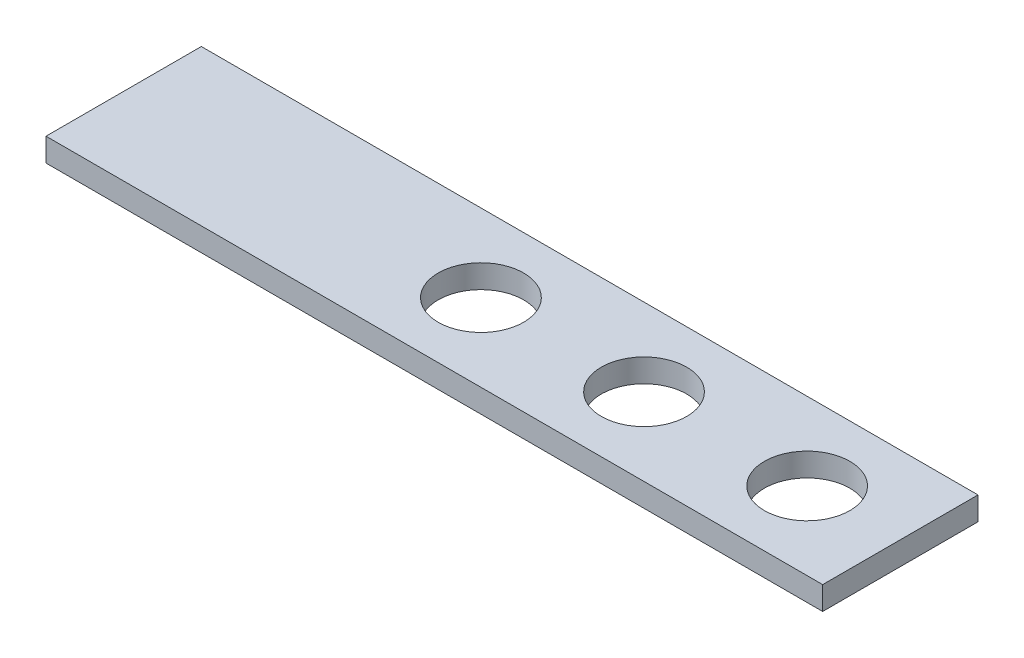
ISO-10303-21;
HEADER;
FILE_DESCRIPTION(('STEP AP214'),'2;1');
FILE_NAME('part.step','',(''),(''),'','','');
FILE_SCHEMA(('AUTOMOTIVE_DESIGN { 1 0 10303 214 1 1 1 1 }'));
ENDSEC;
DATA;
#1=APPLICATION_CONTEXT('core data for automotive mechanical design processes');
#2=APPLICATION_PROTOCOL_DEFINITION('international standard','automotive_design',2000,#1);
#3=PRODUCT_CONTEXT('',#1,'mechanical');
#4=PRODUCT('Part','Part','',(#3));
#5=PRODUCT_RELATED_PRODUCT_CATEGORY('part','',(#4));
#6=PRODUCT_DEFINITION_FORMATION('','',#4);
#7=PRODUCT_DEFINITION_CONTEXT('part definition',#1,'design');
#8=PRODUCT_DEFINITION('design','',#6,#7);
#9=PRODUCT_DEFINITION_SHAPE('','',#8);
#10=(LENGTH_UNIT() NAMED_UNIT(*) SI_UNIT(.MILLI.,.METRE.));
#11=(NAMED_UNIT(*) PLANE_ANGLE_UNIT() SI_UNIT($,.RADIAN.));
#12=(NAMED_UNIT(*) SI_UNIT($,.STERADIAN.) SOLID_ANGLE_UNIT());
#13=UNCERTAINTY_MEASURE_WITH_UNIT(LENGTH_MEASURE(1.E-05),#10,'distance_accuracy_value','');
#14=(GEOMETRIC_REPRESENTATION_CONTEXT(3) GLOBAL_UNCERTAINTY_ASSIGNED_CONTEXT((#13)) GLOBAL_UNIT_ASSIGNED_CONTEXT((#10,
#11,#12)) REPRESENTATION_CONTEXT('',''));
#15=CARTESIAN_POINT('',(0.,0.,0.));
#16=DIRECTION('',(0.,0.,1.));
#17=DIRECTION('',(1.,0.,0.));
#18=AXIS2_PLACEMENT_3D('',#15,#16,#17);
#19=CARTESIAN_POINT('',(0.,3.,0.));
#20=DIRECTION('',(0.,-1.,0.));
#21=DIRECTION('',(0.,0.,-1.));
#22=AXIS2_PLACEMENT_3D('',#19,#20,#21);
#23=PLANE('',#22);
#24=DIRECTION('',(1.,0.,0.));
#25=VECTOR('',#24,1.);
#26=CARTESIAN_POINT('',(100.,3.,0.));
#27=LINE('',#26,#25);
#28=CARTESIAN_POINT('',(0.,3.,0.));
#29=VERTEX_POINT('',#28);
#30=CARTESIAN_POINT('',(100.,3.,0.));
#31=VERTEX_POINT('',#30);
#32=EDGE_CURVE('E97',#29,#31,#27,.T.);
#33=ORIENTED_EDGE('',*,*,#32,.T.);
#34=DIRECTION('',(0.,0.,-1.));
#35=VECTOR('',#34,1.);
#36=CARTESIAN_POINT('',(100.,3.,-20.));
#37=LINE('',#36,#35);
#38=CARTESIAN_POINT('',(100.,3.,-20.));
#39=VERTEX_POINT('',#38);
#40=EDGE_CURVE('E92',#31,#39,#37,.T.);
#41=ORIENTED_EDGE('',*,*,#40,.T.);
#42=DIRECTION('',(-1.,0.,0.));
#43=VECTOR('',#42,1.);
#44=CARTESIAN_POINT('',(0.,3.,-20.));
#45=LINE('',#44,#43);
#46=CARTESIAN_POINT('',(0.,3.,-20.));
#47=VERTEX_POINT('',#46);
#48=EDGE_CURVE('E95',#39,#47,#45,.T.);
#49=ORIENTED_EDGE('',*,*,#48,.T.);
#50=DIRECTION('',(0.,0.,1.));
#51=VECTOR('',#50,1.);
#52=CARTESIAN_POINT('',(0.,3.,0.));
#53=LINE('',#52,#51);
#54=EDGE_CURVE('E62',#47,#29,#53,.T.);
#55=ORIENTED_EDGE('',*,*,#54,.T.);
#56=EDGE_LOOP('',(#33,#41,#49,#55));
#57=FACE_BOUND('',#56,.T.);
#58=CARTESIAN_POINT('',(46.,3.,-10.));
#59=DIRECTION('',(0.,1.,0.));
#60=DIRECTION('',(0.,0.,1.));
#61=AXIS2_PLACEMENT_3D('',#58,#59,#60);
#62=CIRCLE('',#61,5.49999999999999);
#63=CARTESIAN_POINT('',(46.,3.,-4.50000000000001));
#64=VERTEX_POINT('',#63);
#65=EDGE_CURVE('E117',#64,#64,#62,.T.);
#66=ORIENTED_EDGE('',*,*,#65,.F.);
#67=EDGE_LOOP('',(#66));
#68=FACE_BOUND('',#67,.T.);
#69=CARTESIAN_POINT('',(67.,3.,-10.));
#70=DIRECTION('',(0.,1.,0.));
#71=DIRECTION('',(0.,0.,1.));
#72=AXIS2_PLACEMENT_3D('',#69,#70,#71);
#73=CIRCLE('',#72,5.49999999999999);
#74=CARTESIAN_POINT('',(67.,3.,-4.50000000000001));
#75=VERTEX_POINT('',#74);
#76=EDGE_CURVE('E139',#75,#75,#73,.T.);
#77=ORIENTED_EDGE('',*,*,#76,.F.);
#78=EDGE_LOOP('',(#77));
#79=FACE_BOUND('',#78,.T.);
#80=CARTESIAN_POINT('',(88.,3.,-10.));
#81=DIRECTION('',(0.,1.,0.));
#82=DIRECTION('',(0.,0.,1.));
#83=AXIS2_PLACEMENT_3D('',#80,#81,#82);
#84=CIRCLE('',#83,5.49999999999999);
#85=CARTESIAN_POINT('',(88.,3.,-4.50000000000001));
#86=VERTEX_POINT('',#85);
#87=EDGE_CURVE('E147',#86,#86,#84,.T.);
#88=ORIENTED_EDGE('',*,*,#87,.F.);
#89=EDGE_LOOP('',(#88));
#90=FACE_BOUND('',#89,.T.);
#91=ADVANCED_FACE('F44',(#57,#68,#79,#90),#23,.F.);
#92=CARTESIAN_POINT('',(0.,0.,0.));
#93=DIRECTION('',(0.,-1.,0.));
#94=DIRECTION('',(0.,0.,-1.));
#95=AXIS2_PLACEMENT_3D('',#92,#93,#94);
#96=PLANE('',#95);
#97=CARTESIAN_POINT('',(67.,0.,-10.));
#98=DIRECTION('',(0.,1.,0.));
#99=DIRECTION('',(0.,0.,1.));
#100=AXIS2_PLACEMENT_3D('',#97,#98,#99);
#101=CIRCLE('',#100,5.49999999999999);
#102=CARTESIAN_POINT('',(67.,0.,-4.50000000000001));
#103=VERTEX_POINT('',#102);
#104=EDGE_CURVE('E143',#103,#103,#101,.T.);
#105=ORIENTED_EDGE('',*,*,#104,.T.);
#106=EDGE_LOOP('',(#105));
#107=FACE_BOUND('',#106,.T.);
#108=DIRECTION('',(1.,0.,0.));
#109=VECTOR('',#108,1.);
#110=CARTESIAN_POINT('',(100.,0.,0.));
#111=LINE('',#110,#109);
#112=CARTESIAN_POINT('',(0.,0.,0.));
#113=VERTEX_POINT('',#112);
#114=CARTESIAN_POINT('',(100.,0.,0.));
#115=VERTEX_POINT('',#114);
#116=EDGE_CURVE('E113',#113,#115,#111,.T.);
#117=ORIENTED_EDGE('',*,*,#116,.F.);
#118=DIRECTION('',(0.,0.,1.));
#119=VECTOR('',#118,1.);
#120=CARTESIAN_POINT('',(0.,0.,0.));
#121=LINE('',#120,#119);
#122=CARTESIAN_POINT('',(0.,0.,-20.));
#123=VERTEX_POINT('',#122);
#124=EDGE_CURVE('E85',#123,#113,#121,.T.);
#125=ORIENTED_EDGE('',*,*,#124,.F.);
#126=DIRECTION('',(-1.,0.,0.));
#127=VECTOR('',#126,1.);
#128=CARTESIAN_POINT('',(0.,0.,-20.));
#129=LINE('',#128,#127);
#130=CARTESIAN_POINT('',(100.,0.,-20.));
#131=VERTEX_POINT('',#130);
#132=EDGE_CURVE('E79',#131,#123,#129,.T.);
#133=ORIENTED_EDGE('',*,*,#132,.F.);
#134=DIRECTION('',(0.,0.,-1.));
#135=VECTOR('',#134,1.);
#136=CARTESIAN_POINT('',(100.,0.,-20.));
#137=LINE('',#136,#135);
#138=EDGE_CURVE('E102',#115,#131,#137,.T.);
#139=ORIENTED_EDGE('',*,*,#138,.F.);
#140=EDGE_LOOP('',(#117,#125,#133,#139));
#141=FACE_BOUND('',#140,.T.);
#142=CARTESIAN_POINT('',(46.,0.,-10.));
#143=DIRECTION('',(0.,1.,0.));
#144=DIRECTION('',(0.,0.,1.));
#145=AXIS2_PLACEMENT_3D('',#142,#143,#144);
#146=CIRCLE('',#145,5.49999999999999);
#147=CARTESIAN_POINT('',(46.,0.,-4.50000000000001));
#148=VERTEX_POINT('',#147);
#149=EDGE_CURVE('E135',#148,#148,#146,.T.);
#150=ORIENTED_EDGE('',*,*,#149,.T.);
#151=EDGE_LOOP('',(#150));
#152=FACE_BOUND('',#151,.T.);
#153=CARTESIAN_POINT('',(88.,0.,-10.));
#154=DIRECTION('',(0.,1.,0.));
#155=DIRECTION('',(0.,0.,1.));
#156=AXIS2_PLACEMENT_3D('',#153,#154,#155);
#157=CIRCLE('',#156,5.49999999999999);
#158=CARTESIAN_POINT('',(88.,0.,-4.50000000000001));
#159=VERTEX_POINT('',#158);
#160=EDGE_CURVE('E151',#159,#159,#157,.T.);
#161=ORIENTED_EDGE('',*,*,#160,.T.);
#162=EDGE_LOOP('',(#161));
#163=FACE_BOUND('',#162,.T.);
#164=ADVANCED_FACE('F130',(#107,#141,#152,#163),#96,.T.);
#165=CARTESIAN_POINT('',(100.,3.,0.));
#166=DIRECTION('',(0.,0.,-1.));
#167=DIRECTION('',(-1.,0.,0.));
#168=AXIS2_PLACEMENT_3D('',#165,#166,#167);
#169=PLANE('',#168);
#170=ORIENTED_EDGE('',*,*,#116,.T.);
#171=DIRECTION('',(0.,-1.,0.));
#172=VECTOR('',#171,1.);
#173=CARTESIAN_POINT('',(100.,3.,0.));
#174=LINE('',#173,#172);
#175=EDGE_CURVE('E11',#31,#115,#174,.T.);
#176=ORIENTED_EDGE('',*,*,#175,.F.);
#177=ORIENTED_EDGE('',*,*,#32,.F.);
#178=DIRECTION('',(0.,-1.,0.));
#179=VECTOR('',#178,1.);
#180=CARTESIAN_POINT('',(0.,3.,0.));
#181=LINE('',#180,#179);
#182=EDGE_CURVE('E109',#29,#113,#181,.T.);
#183=ORIENTED_EDGE('',*,*,#182,.T.);
#184=EDGE_LOOP('',(#170,#176,#177,#183));
#185=FACE_BOUND('',#184,.T.);
#186=ADVANCED_FACE('F46',(#185),#169,.F.);
#187=CARTESIAN_POINT('',(100.,3.,-20.));
#188=DIRECTION('',(-1.,0.,0.));
#189=DIRECTION('',(0.,0.,1.));
#190=AXIS2_PLACEMENT_3D('',#187,#188,#189);
#191=PLANE('',#190);
#192=ORIENTED_EDGE('',*,*,#138,.T.);
#193=DIRECTION('',(0.,-1.,0.));
#194=VECTOR('',#193,1.);
#195=CARTESIAN_POINT('',(100.,3.,-20.));
#196=LINE('',#195,#194);
#197=EDGE_CURVE('E54',#39,#131,#196,.T.);
#198=ORIENTED_EDGE('',*,*,#197,.F.);
#199=ORIENTED_EDGE('',*,*,#40,.F.);
#200=ORIENTED_EDGE('',*,*,#175,.T.);
#201=EDGE_LOOP('',(#192,#198,#199,#200));
#202=FACE_BOUND('',#201,.T.);
#203=ADVANCED_FACE('F101',(#202),#191,.F.);
#204=CARTESIAN_POINT('',(0.,3.,-20.));
#205=DIRECTION('',(0.,0.,1.));
#206=DIRECTION('',(1.,0.,0.));
#207=AXIS2_PLACEMENT_3D('',#204,#205,#206);
#208=PLANE('',#207);
#209=ORIENTED_EDGE('',*,*,#132,.T.);
#210=DIRECTION('',(0.,-1.,0.));
#211=VECTOR('',#210,1.);
#212=CARTESIAN_POINT('',(0.,3.,-20.));
#213=LINE('',#212,#211);
#214=EDGE_CURVE('E104',#47,#123,#213,.T.);
#215=ORIENTED_EDGE('',*,*,#214,.F.);
#216=ORIENTED_EDGE('',*,*,#48,.F.);
#217=ORIENTED_EDGE('',*,*,#197,.T.);
#218=EDGE_LOOP('',(#209,#215,#216,#217));
#219=FACE_BOUND('',#218,.T.);
#220=ADVANCED_FACE('F105',(#219),#208,.F.);
#221=CARTESIAN_POINT('',(0.,3.,0.));
#222=DIRECTION('',(1.,0.,0.));
#223=DIRECTION('',(0.,0.,-1.));
#224=AXIS2_PLACEMENT_3D('',#221,#222,#223);
#225=PLANE('',#224);
#226=ORIENTED_EDGE('',*,*,#124,.T.);
#227=ORIENTED_EDGE('',*,*,#182,.F.);
#228=ORIENTED_EDGE('',*,*,#54,.F.);
#229=ORIENTED_EDGE('',*,*,#214,.T.);
#230=EDGE_LOOP('',(#226,#227,#228,#229));
#231=FACE_BOUND('',#230,.T.);
#232=ADVANCED_FACE('F127',(#231),#225,.F.);
#233=CARTESIAN_POINT('',(46.,3.,-10.));
#234=DIRECTION('',(0.,-1.,0.));
#235=DIRECTION('',(0.,0.,-1.));
#236=AXIS2_PLACEMENT_3D('',#233,#234,#235);
#237=CYLINDRICAL_SURFACE('',#236,5.49999999999999);
#238=ORIENTED_EDGE('',*,*,#65,.T.);
#239=EDGE_LOOP('',(#238));
#240=FACE_BOUND('',#239,.T.);
#241=ORIENTED_EDGE('',*,*,#149,.F.);
#242=EDGE_LOOP('',(#241));
#243=FACE_BOUND('',#242,.T.);
#244=ADVANCED_FACE('F170',(#240,#243),#237,.F.);
#245=CARTESIAN_POINT('',(67.,3.,-10.));
#246=DIRECTION('',(0.,-1.,0.));
#247=DIRECTION('',(0.,0.,-1.));
#248=AXIS2_PLACEMENT_3D('',#245,#246,#247);
#249=CYLINDRICAL_SURFACE('',#248,5.49999999999999);
#250=ORIENTED_EDGE('',*,*,#76,.T.);
#251=EDGE_LOOP('',(#250));
#252=FACE_BOUND('',#251,.T.);
#253=ORIENTED_EDGE('',*,*,#104,.F.);
#254=EDGE_LOOP('',(#253));
#255=FACE_BOUND('',#254,.T.);
#256=ADVANCED_FACE('F215',(#252,#255),#249,.F.);
#257=CARTESIAN_POINT('',(88.,3.,-10.));
#258=DIRECTION('',(0.,-1.,0.));
#259=DIRECTION('',(0.,0.,-1.));
#260=AXIS2_PLACEMENT_3D('',#257,#258,#259);
#261=CYLINDRICAL_SURFACE('',#260,5.49999999999999);
#262=ORIENTED_EDGE('',*,*,#87,.T.);
#263=EDGE_LOOP('',(#262));
#264=FACE_BOUND('',#263,.T.);
#265=ORIENTED_EDGE('',*,*,#160,.F.);
#266=EDGE_LOOP('',(#265));
#267=FACE_BOUND('',#266,.T.);
#268=ADVANCED_FACE('F159',(#264,#267),#261,.F.);
#269=CLOSED_SHELL('',(#91,#164,#186,#203,#220,#232,#244,#256,#268));
#270=MANIFOLD_SOLID_BREP('B2',#269);
#271=ADVANCED_BREP_SHAPE_REPRESENTATION('',(#18,#270),#14);
#272=SHAPE_DEFINITION_REPRESENTATION(#9,#271);
ENDSEC;
END-ISO-10303-21;
